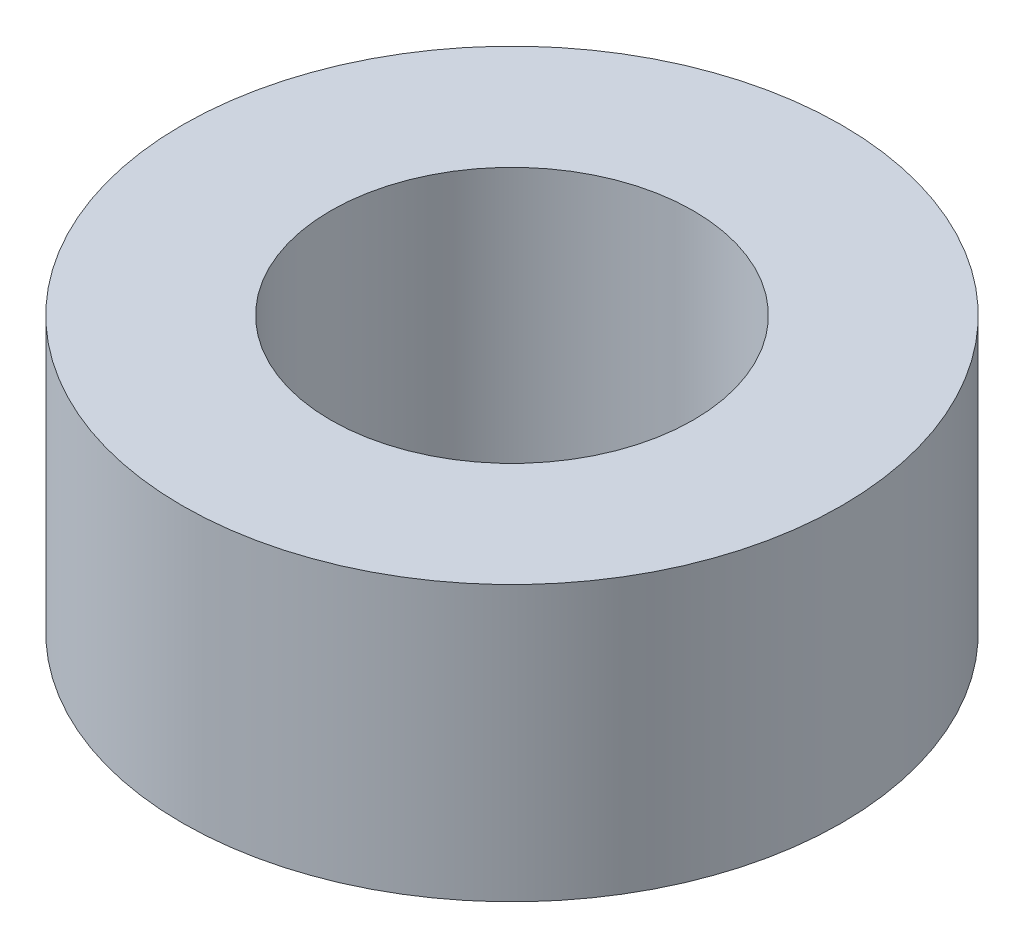
ISO-10303-21;
HEADER;
FILE_DESCRIPTION(('STEP AP214'),'2;1');
FILE_NAME('part.step','',(''),(''),'','','');
FILE_SCHEMA(('AUTOMOTIVE_DESIGN { 1 0 10303 214 1 1 1 1 }'));
ENDSEC;
DATA;
#1=APPLICATION_CONTEXT('core data for automotive mechanical design processes');
#2=APPLICATION_PROTOCOL_DEFINITION('international standard','automotive_design',2000,#1);
#3=PRODUCT_CONTEXT('',#1,'mechanical');
#4=PRODUCT('Part','Part','',(#3));
#5=PRODUCT_RELATED_PRODUCT_CATEGORY('part','',(#4));
#6=PRODUCT_DEFINITION_FORMATION('','',#4);
#7=PRODUCT_DEFINITION_CONTEXT('part definition',#1,'design');
#8=PRODUCT_DEFINITION('design','',#6,#7);
#9=PRODUCT_DEFINITION_SHAPE('','',#8);
#10=(LENGTH_UNIT() NAMED_UNIT(*) SI_UNIT(.MILLI.,.METRE.));
#11=(NAMED_UNIT(*) PLANE_ANGLE_UNIT() SI_UNIT($,.RADIAN.));
#12=(NAMED_UNIT(*) SI_UNIT($,.STERADIAN.) SOLID_ANGLE_UNIT());
#13=UNCERTAINTY_MEASURE_WITH_UNIT(LENGTH_MEASURE(1.E-05),#10,'distance_accuracy_value','');
#14=(GEOMETRIC_REPRESENTATION_CONTEXT(3) GLOBAL_UNCERTAINTY_ASSIGNED_CONTEXT((#13)) GLOBAL_UNIT_ASSIGNED_CONTEXT((#10,
#11,#12)) REPRESENTATION_CONTEXT('',''));
#15=CARTESIAN_POINT('',(0.,0.,0.));
#16=DIRECTION('',(0.,0.,1.));
#17=DIRECTION('',(1.,0.,0.));
#18=AXIS2_PLACEMENT_3D('',#15,#16,#17);
#19=CARTESIAN_POINT('',(0.,2.5,0.));
#20=DIRECTION('',(0.,1.,0.));
#21=DIRECTION('',(0.,0.,1.));
#22=AXIS2_PLACEMENT_3D('',#19,#20,#21);
#23=PLANE('',#22);
#24=CARTESIAN_POINT('',(0.,2.5,0.));
#25=DIRECTION('',(0.,1.,0.));
#26=DIRECTION('',(0.,0.,1.));
#27=AXIS2_PLACEMENT_3D('',#24,#25,#26);
#28=CIRCLE('',#27,3.);
#29=CARTESIAN_POINT('',(0.,2.5,3.));
#30=VERTEX_POINT('',#29);
#31=EDGE_CURVE('E10',#30,#30,#28,.T.);
#32=ORIENTED_EDGE('',*,*,#31,.T.);
#33=EDGE_LOOP('',(#32));
#34=FACE_BOUND('',#33,.T.);
#35=CARTESIAN_POINT('',(0.,2.5,0.));
#36=DIRECTION('',(0.,1.,0.));
#37=DIRECTION('',(0.,0.,1.));
#38=AXIS2_PLACEMENT_3D('',#35,#36,#37);
#39=CIRCLE('',#38,1.65);
#40=CARTESIAN_POINT('',(0.,2.5,1.65));
#41=VERTEX_POINT('',#40);
#42=EDGE_CURVE('E41',#41,#41,#39,.T.);
#43=ORIENTED_EDGE('',*,*,#42,.F.);
#44=EDGE_LOOP('',(#43));
#45=FACE_BOUND('',#44,.T.);
#46=ADVANCED_FACE('F30',(#34,#45),#23,.T.);
#47=CARTESIAN_POINT('',(0.,0.,0.));
#48=DIRECTION('',(0.,1.,0.));
#49=DIRECTION('',(0.,0.,1.));
#50=AXIS2_PLACEMENT_3D('',#47,#48,#49);
#51=PLANE('',#50);
#52=CARTESIAN_POINT('',(0.,0.,0.));
#53=DIRECTION('',(0.,1.,0.));
#54=DIRECTION('',(0.,0.,1.));
#55=AXIS2_PLACEMENT_3D('',#52,#53,#54);
#56=CIRCLE('',#55,3.);
#57=CARTESIAN_POINT('',(0.,0.,3.));
#58=VERTEX_POINT('',#57);
#59=EDGE_CURVE('E34',#58,#58,#56,.T.);
#60=ORIENTED_EDGE('',*,*,#59,.F.);
#61=EDGE_LOOP('',(#60));
#62=FACE_BOUND('',#61,.T.);
#63=CARTESIAN_POINT('',(0.,0.,0.));
#64=DIRECTION('',(0.,1.,0.));
#65=DIRECTION('',(0.,0.,1.));
#66=AXIS2_PLACEMENT_3D('',#63,#64,#65);
#67=CIRCLE('',#66,1.65);
#68=CARTESIAN_POINT('',(0.,0.,1.65));
#69=VERTEX_POINT('',#68);
#70=EDGE_CURVE('E43',#69,#69,#67,.T.);
#71=ORIENTED_EDGE('',*,*,#70,.T.);
#72=EDGE_LOOP('',(#71));
#73=FACE_BOUND('',#72,.T.);
#74=ADVANCED_FACE('F53',(#62,#73),#51,.F.);
#75=CARTESIAN_POINT('',(0.,2.5,0.));
#76=DIRECTION('',(0.,-1.,0.));
#77=DIRECTION('',(0.,0.,-1.));
#78=AXIS2_PLACEMENT_3D('',#75,#76,#77);
#79=CYLINDRICAL_SURFACE('',#78,3.);
#80=ORIENTED_EDGE('',*,*,#31,.F.);
#81=EDGE_LOOP('',(#80));
#82=FACE_BOUND('',#81,.T.);
#83=ORIENTED_EDGE('',*,*,#59,.T.);
#84=EDGE_LOOP('',(#83));
#85=FACE_BOUND('',#84,.T.);
#86=ADVANCED_FACE('F32',(#82,#85),#79,.T.);
#87=CARTESIAN_POINT('',(0.,2.5,0.));
#88=DIRECTION('',(0.,-1.,0.));
#89=DIRECTION('',(0.,0.,-1.));
#90=AXIS2_PLACEMENT_3D('',#87,#88,#89);
#91=CYLINDRICAL_SURFACE('',#90,1.65);
#92=ORIENTED_EDGE('',*,*,#42,.T.);
#93=EDGE_LOOP('',(#92));
#94=FACE_BOUND('',#93,.T.);
#95=ORIENTED_EDGE('',*,*,#70,.F.);
#96=EDGE_LOOP('',(#95));
#97=FACE_BOUND('',#96,.T.);
#98=ADVANCED_FACE('F49',(#94,#97),#91,.F.);
#99=CLOSED_SHELL('',(#46,#74,#86,#98));
#100=MANIFOLD_SOLID_BREP('B2',#99);
#101=ADVANCED_BREP_SHAPE_REPRESENTATION('',(#18,#100),#14);
#102=SHAPE_DEFINITION_REPRESENTATION(#9,#101);
ENDSEC;
END-ISO-10303-21;
